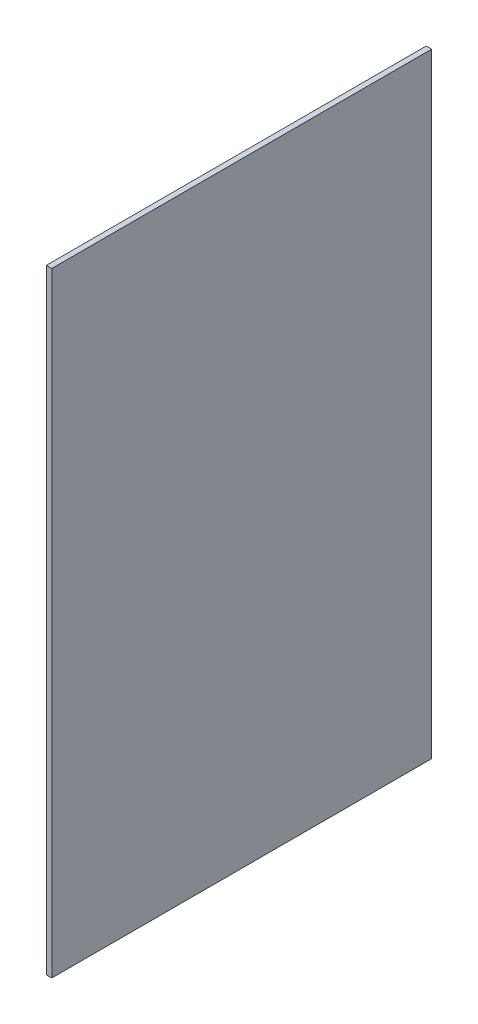
ISO-10303-21;
HEADER;
FILE_DESCRIPTION(('STEP AP214'),'2;1');
FILE_NAME('part.step','',(''),(''),'','','');
FILE_SCHEMA(('AUTOMOTIVE_DESIGN { 1 0 10303 214 1 1 1 1 }'));
ENDSEC;
DATA;
#1=APPLICATION_CONTEXT('core data for automotive mechanical design processes');
#2=APPLICATION_PROTOCOL_DEFINITION('international standard','automotive_design',2000,#1);
#3=PRODUCT_CONTEXT('',#1,'mechanical');
#4=PRODUCT('Part','Part','',(#3));
#5=PRODUCT_RELATED_PRODUCT_CATEGORY('part','',(#4));
#6=PRODUCT_DEFINITION_FORMATION('','',#4);
#7=PRODUCT_DEFINITION_CONTEXT('part definition',#1,'design');
#8=PRODUCT_DEFINITION('design','',#6,#7);
#9=PRODUCT_DEFINITION_SHAPE('','',#8);
#10=(LENGTH_UNIT() NAMED_UNIT(*) SI_UNIT(.MILLI.,.METRE.));
#11=(NAMED_UNIT(*) PLANE_ANGLE_UNIT() SI_UNIT($,.RADIAN.));
#12=(NAMED_UNIT(*) SI_UNIT($,.STERADIAN.) SOLID_ANGLE_UNIT());
#13=UNCERTAINTY_MEASURE_WITH_UNIT(LENGTH_MEASURE(1.E-05),#10,'distance_accuracy_value','');
#14=(GEOMETRIC_REPRESENTATION_CONTEXT(3) GLOBAL_UNCERTAINTY_ASSIGNED_CONTEXT((#13)) GLOBAL_UNIT_ASSIGNED_CONTEXT((#10,
#11,#12)) REPRESENTATION_CONTEXT('',''));
#15=CARTESIAN_POINT('',(0.,0.,0.));
#16=DIRECTION('',(0.,0.,1.));
#17=DIRECTION('',(1.,0.,0.));
#18=AXIS2_PLACEMENT_3D('',#15,#16,#17);
#19=CARTESIAN_POINT('',(450.,81.3000000000001,230.));
#20=DIRECTION('',(0.,1.,0.));
#21=DIRECTION('',(0.,0.,1.));
#22=AXIS2_PLACEMENT_3D('',#19,#20,#21);
#23=PLANE('',#22);
#24=DIRECTION('',(1.,0.,0.));
#25=VECTOR('',#24,1.);
#26=CARTESIAN_POINT('',(450.,81.3000000000001,0.));
#27=LINE('',#26,#25);
#28=CARTESIAN_POINT('',(450.,81.3000000000001,0.));
#29=VERTEX_POINT('',#28);
#30=CARTESIAN_POINT('',(453.3,81.3000000000001,0.));
#31=VERTEX_POINT('',#30);
#32=EDGE_CURVE('E96',#29,#31,#27,.T.);
#33=ORIENTED_EDGE('',*,*,#32,.T.);
#34=DIRECTION('',(0.,0.,-1.));
#35=VECTOR('',#34,1.);
#36=CARTESIAN_POINT('',(453.3,81.3000000000001,230.));
#37=LINE('',#36,#35);
#38=CARTESIAN_POINT('',(453.3,81.3000000000001,230.));
#39=VERTEX_POINT('',#38);
#40=EDGE_CURVE('E11',#39,#31,#37,.T.);
#41=ORIENTED_EDGE('',*,*,#40,.F.);
#42=DIRECTION('',(1.,0.,0.));
#43=VECTOR('',#42,1.);
#44=CARTESIAN_POINT('',(450.,81.3000000000001,230.));
#45=LINE('',#44,#43);
#46=CARTESIAN_POINT('',(450.,81.3000000000001,230.));
#47=VERTEX_POINT('',#46);
#48=EDGE_CURVE('E84',#47,#39,#45,.T.);
#49=ORIENTED_EDGE('',*,*,#48,.F.);
#50=DIRECTION('',(0.,0.,-1.));
#51=VECTOR('',#50,1.);
#52=CARTESIAN_POINT('',(450.,81.3000000000001,230.));
#53=LINE('',#52,#51);
#54=EDGE_CURVE('E92',#47,#29,#53,.T.);
#55=ORIENTED_EDGE('',*,*,#54,.T.);
#56=EDGE_LOOP('',(#33,#41,#49,#55));
#57=FACE_BOUND('',#56,.T.);
#58=ADVANCED_FACE('F33',(#57),#23,.F.);
#59=CARTESIAN_POINT('',(453.3,81.3000000000001,230.));
#60=DIRECTION('',(-1.,0.,0.));
#61=DIRECTION('',(0.,0.,1.));
#62=AXIS2_PLACEMENT_3D('',#59,#60,#61);
#63=PLANE('',#62);
#64=DIRECTION('',(0.,1.,0.));
#65=VECTOR('',#64,1.);
#66=CARTESIAN_POINT('',(453.3,81.3000000000001,0.));
#67=LINE('',#66,#65);
#68=CARTESIAN_POINT('',(453.3,453.3,0.));
#69=VERTEX_POINT('',#68);
#70=EDGE_CURVE('E88',#31,#69,#67,.T.);
#71=ORIENTED_EDGE('',*,*,#70,.T.);
#72=DIRECTION('',(0.,0.,-1.));
#73=VECTOR('',#72,1.);
#74=CARTESIAN_POINT('',(453.3,453.3,230.));
#75=LINE('',#74,#73);
#76=CARTESIAN_POINT('',(453.3,453.3,230.));
#77=VERTEX_POINT('',#76);
#78=EDGE_CURVE('E41',#77,#69,#75,.T.);
#79=ORIENTED_EDGE('',*,*,#78,.F.);
#80=DIRECTION('',(0.,1.,0.));
#81=VECTOR('',#80,1.);
#82=CARTESIAN_POINT('',(453.3,81.3000000000001,230.));
#83=LINE('',#82,#81);
#84=EDGE_CURVE('E79',#39,#77,#83,.T.);
#85=ORIENTED_EDGE('',*,*,#84,.F.);
#86=ORIENTED_EDGE('',*,*,#40,.T.);
#87=EDGE_LOOP('',(#71,#79,#85,#86));
#88=FACE_BOUND('',#87,.T.);
#89=ADVANCED_FACE('F87',(#88),#63,.F.);
#90=CARTESIAN_POINT('',(453.3,453.3,230.));
#91=DIRECTION('',(0.,-1.,0.));
#92=DIRECTION('',(0.,0.,-1.));
#93=AXIS2_PLACEMENT_3D('',#90,#91,#92);
#94=PLANE('',#93);
#95=DIRECTION('',(-1.,0.,0.));
#96=VECTOR('',#95,1.);
#97=CARTESIAN_POINT('',(453.3,453.3,0.));
#98=LINE('',#97,#96);
#99=CARTESIAN_POINT('',(450.,453.3,0.));
#100=VERTEX_POINT('',#99);
#101=EDGE_CURVE('E66',#69,#100,#98,.T.);
#102=ORIENTED_EDGE('',*,*,#101,.T.);
#103=DIRECTION('',(0.,0.,-1.));
#104=VECTOR('',#103,1.);
#105=CARTESIAN_POINT('',(450.,453.3,230.));
#106=LINE('',#105,#104);
#107=CARTESIAN_POINT('',(450.,453.3,230.));
#108=VERTEX_POINT('',#107);
#109=EDGE_CURVE('E89',#108,#100,#106,.T.);
#110=ORIENTED_EDGE('',*,*,#109,.F.);
#111=DIRECTION('',(-1.,0.,0.));
#112=VECTOR('',#111,1.);
#113=CARTESIAN_POINT('',(453.3,453.3,230.));
#114=LINE('',#113,#112);
#115=EDGE_CURVE('E82',#77,#108,#114,.T.);
#116=ORIENTED_EDGE('',*,*,#115,.F.);
#117=ORIENTED_EDGE('',*,*,#78,.T.);
#118=EDGE_LOOP('',(#102,#110,#116,#117));
#119=FACE_BOUND('',#118,.T.);
#120=ADVANCED_FACE('F90',(#119),#94,.F.);
#121=CARTESIAN_POINT('',(450.,81.3000000000001,230.));
#122=DIRECTION('',(1.,0.,0.));
#123=DIRECTION('',(0.,0.,-1.));
#124=AXIS2_PLACEMENT_3D('',#121,#122,#123);
#125=PLANE('',#124);
#126=DIRECTION('',(0.,-1.,0.));
#127=VECTOR('',#126,1.);
#128=CARTESIAN_POINT('',(450.,81.3000000000001,0.));
#129=LINE('',#128,#127);
#130=EDGE_CURVE('E72',#100,#29,#129,.T.);
#131=ORIENTED_EDGE('',*,*,#130,.T.);
#132=ORIENTED_EDGE('',*,*,#54,.F.);
#133=DIRECTION('',(0.,-1.,0.));
#134=VECTOR('',#133,1.);
#135=CARTESIAN_POINT('',(450.,81.3000000000001,230.));
#136=LINE('',#135,#134);
#137=EDGE_CURVE('E49',#108,#47,#136,.T.);
#138=ORIENTED_EDGE('',*,*,#137,.F.);
#139=ORIENTED_EDGE('',*,*,#109,.T.);
#140=EDGE_LOOP('',(#131,#132,#138,#139));
#141=FACE_BOUND('',#140,.T.);
#142=ADVANCED_FACE('F103',(#141),#125,.F.);
#143=CARTESIAN_POINT('',(0.,0.,230.));
#144=DIRECTION('',(0.,0.,1.));
#145=DIRECTION('',(1.,0.,0.));
#146=AXIS2_PLACEMENT_3D('',#143,#144,#145);
#147=PLANE('',#146);
#148=ORIENTED_EDGE('',*,*,#48,.T.);
#149=ORIENTED_EDGE('',*,*,#84,.T.);
#150=ORIENTED_EDGE('',*,*,#115,.T.);
#151=ORIENTED_EDGE('',*,*,#137,.T.);
#152=EDGE_LOOP('',(#148,#149,#150,#151));
#153=FACE_BOUND('',#152,.T.);
#154=ADVANCED_FACE('F80',(#153),#147,.T.);
#155=CARTESIAN_POINT('',(0.,0.,0.));
#156=DIRECTION('',(0.,0.,1.));
#157=DIRECTION('',(1.,0.,0.));
#158=AXIS2_PLACEMENT_3D('',#155,#156,#157);
#159=PLANE('',#158);
#160=ORIENTED_EDGE('',*,*,#32,.F.);
#161=ORIENTED_EDGE('',*,*,#130,.F.);
#162=ORIENTED_EDGE('',*,*,#101,.F.);
#163=ORIENTED_EDGE('',*,*,#70,.F.);
#164=EDGE_LOOP('',(#160,#161,#162,#163));
#165=FACE_BOUND('',#164,.T.);
#166=ADVANCED_FACE('F106',(#165),#159,.F.);
#167=CLOSED_SHELL('',(#58,#89,#120,#142,#154,#166));
#168=MANIFOLD_SOLID_BREP('B2',#167);
#169=ADVANCED_BREP_SHAPE_REPRESENTATION('',(#18,#168),#14);
#170=SHAPE_DEFINITION_REPRESENTATION(#9,#169);
ENDSEC;
END-ISO-10303-21;
